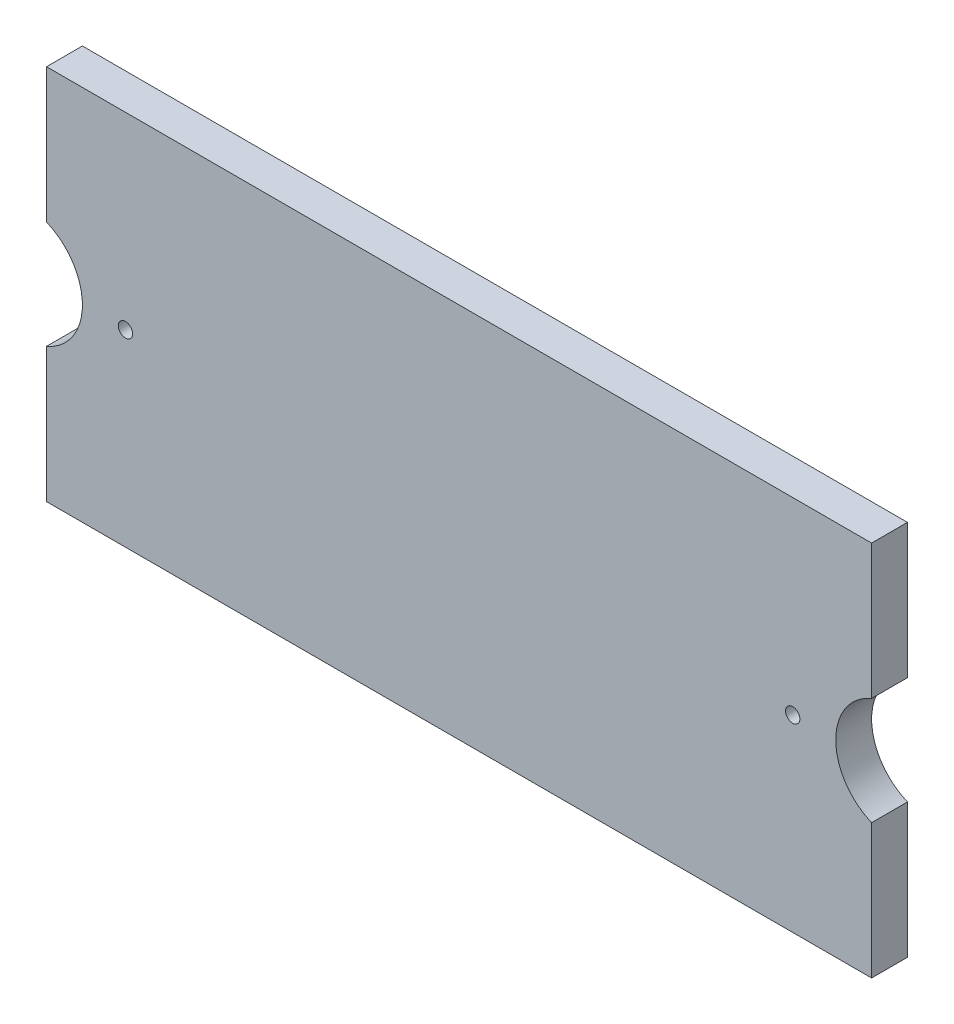
ISO-10303-21;
HEADER;
FILE_DESCRIPTION(('STEP AP214'),'2;1');
FILE_NAME('part.step','',(''),(''),'','','');
FILE_SCHEMA(('AUTOMOTIVE_DESIGN { 1 0 10303 214 1 1 1 1 }'));
ENDSEC;
DATA;
#1=APPLICATION_CONTEXT('core data for automotive mechanical design processes');
#2=APPLICATION_PROTOCOL_DEFINITION('international standard','automotive_design',2000,#1);
#3=PRODUCT_CONTEXT('',#1,'mechanical');
#4=PRODUCT('Part','Part','',(#3));
#5=PRODUCT_RELATED_PRODUCT_CATEGORY('part','',(#4));
#6=PRODUCT_DEFINITION_FORMATION('','',#4);
#7=PRODUCT_DEFINITION_CONTEXT('part definition',#1,'design');
#8=PRODUCT_DEFINITION('design','',#6,#7);
#9=PRODUCT_DEFINITION_SHAPE('','',#8);
#10=(LENGTH_UNIT() NAMED_UNIT(*) SI_UNIT(.MILLI.,.METRE.));
#11=(NAMED_UNIT(*) PLANE_ANGLE_UNIT() SI_UNIT($,.RADIAN.));
#12=(NAMED_UNIT(*) SI_UNIT($,.STERADIAN.) SOLID_ANGLE_UNIT());
#13=UNCERTAINTY_MEASURE_WITH_UNIT(LENGTH_MEASURE(1.E-05),#10,'distance_accuracy_value','');
#14=(GEOMETRIC_REPRESENTATION_CONTEXT(3) GLOBAL_UNCERTAINTY_ASSIGNED_CONTEXT((#13)) GLOBAL_UNIT_ASSIGNED_CONTEXT((#10,
#11,#12)) REPRESENTATION_CONTEXT('',''));
#15=CARTESIAN_POINT('',(0.,0.,0.));
#16=DIRECTION('',(0.,0.,1.));
#17=DIRECTION('',(1.,0.,0.));
#18=AXIS2_PLACEMENT_3D('',#15,#16,#17);
#19=CARTESIAN_POINT('',(-6.25000000000003,52.5,10.));
#20=DIRECTION('',(0.,0.,-1.));
#21=DIRECTION('',(-1.,0.,0.));
#22=AXIS2_PLACEMENT_3D('',#19,#20,#21);
#23=PLANE('',#22);
#24=DIRECTION('',(0.,-1.,0.));
#25=VECTOR('',#24,1.);
#26=CARTESIAN_POINT('',(0.,0.,10.));
#27=LINE('',#26,#25);
#28=CARTESIAN_POINT('',(0.,37.5,10.));
#29=VERTEX_POINT('',#28);
#30=CARTESIAN_POINT('',(0.,0.,10.));
#31=VERTEX_POINT('',#30);
#32=EDGE_CURVE('E145',#29,#31,#27,.T.);
#33=ORIENTED_EDGE('',*,*,#32,.T.);
#34=DIRECTION('',(1.,0.,0.));
#35=VECTOR('',#34,1.);
#36=CARTESIAN_POINT('',(0.,0.,10.));
#37=LINE('',#36,#35);
#38=CARTESIAN_POINT('',(230.,0.,10.));
#39=VERTEX_POINT('',#38);
#40=EDGE_CURVE('E93',#31,#39,#37,.T.);
#41=ORIENTED_EDGE('',*,*,#40,.T.);
#42=DIRECTION('',(0.,1.,0.));
#43=VECTOR('',#42,1.);
#44=CARTESIAN_POINT('',(230.,0.,10.));
#45=LINE('',#44,#43);
#46=CARTESIAN_POINT('',(230.,37.5,10.));
#47=VERTEX_POINT('',#46);
#48=EDGE_CURVE('E160',#39,#47,#45,.T.);
#49=ORIENTED_EDGE('',*,*,#48,.T.);
#50=CARTESIAN_POINT('',(236.25,52.5,10.));
#51=DIRECTION('',(0.,0.,-1.));
#52=DIRECTION('',(1.,0.,0.));
#53=AXIS2_PLACEMENT_3D('',#50,#51,#52);
#54=CIRCLE('',#53,16.25);
#55=CARTESIAN_POINT('',(230.,67.5,10.));
#56=VERTEX_POINT('',#55);
#57=EDGE_CURVE('E173',#47,#56,#54,.T.);
#58=ORIENTED_EDGE('',*,*,#57,.T.);
#59=DIRECTION('',(0.,1.,0.));
#60=VECTOR('',#59,1.);
#61=CARTESIAN_POINT('',(230.,67.5,10.));
#62=LINE('',#61,#60);
#63=CARTESIAN_POINT('',(230.,105.,10.));
#64=VERTEX_POINT('',#63);
#65=EDGE_CURVE('E112',#56,#64,#62,.T.);
#66=ORIENTED_EDGE('',*,*,#65,.T.);
#67=DIRECTION('',(-1.,0.,0.));
#68=VECTOR('',#67,1.);
#69=CARTESIAN_POINT('',(0.,105.,10.));
#70=LINE('',#69,#68);
#71=CARTESIAN_POINT('',(0.,105.,10.));
#72=VERTEX_POINT('',#71);
#73=EDGE_CURVE('E106',#64,#72,#70,.T.);
#74=ORIENTED_EDGE('',*,*,#73,.T.);
#75=DIRECTION('',(0.,-1.,0.));
#76=VECTOR('',#75,1.);
#77=CARTESIAN_POINT('',(0.,67.5,10.));
#78=LINE('',#77,#76);
#79=CARTESIAN_POINT('',(0.,67.5,10.));
#80=VERTEX_POINT('',#79);
#81=EDGE_CURVE('E110',#72,#80,#78,.T.);
#82=ORIENTED_EDGE('',*,*,#81,.T.);
#83=CARTESIAN_POINT('',(-6.25000000000003,52.5,10.));
#84=DIRECTION('',(0.,0.,-1.));
#85=DIRECTION('',(-1.,0.,0.));
#86=AXIS2_PLACEMENT_3D('',#83,#84,#85);
#87=CIRCLE('',#86,16.25);
#88=EDGE_CURVE('E50',#80,#29,#87,.T.);
#89=ORIENTED_EDGE('',*,*,#88,.T.);
#90=EDGE_LOOP('',(#33,#41,#49,#58,#66,#74,#82,#89));
#91=FACE_BOUND('',#90,.T.);
#92=CARTESIAN_POINT('',(208.,52.5,10.));
#93=DIRECTION('',(0.,0.,1.));
#94=DIRECTION('',(1.,0.,0.));
#95=AXIS2_PLACEMENT_3D('',#92,#93,#94);
#96=CIRCLE('',#95,2.);
#97=CARTESIAN_POINT('',(210.,52.5,10.));
#98=VERTEX_POINT('',#97);
#99=EDGE_CURVE('E134',#98,#98,#96,.T.);
#100=ORIENTED_EDGE('',*,*,#99,.F.);
#101=EDGE_LOOP('',(#100));
#102=FACE_BOUND('',#101,.T.);
#103=CARTESIAN_POINT('',(22.,52.5,10.));
#104=DIRECTION('',(0.,0.,1.));
#105=DIRECTION('',(-1.,0.,0.));
#106=AXIS2_PLACEMENT_3D('',#103,#104,#105);
#107=CIRCLE('',#106,2.);
#108=CARTESIAN_POINT('',(20.,52.5,10.));
#109=VERTEX_POINT('',#108);
#110=EDGE_CURVE('E182',#109,#109,#107,.T.);
#111=ORIENTED_EDGE('',*,*,#110,.F.);
#112=EDGE_LOOP('',(#111));
#113=FACE_BOUND('',#112,.T.);
#114=ADVANCED_FACE('F33',(#91,#102,#113),#23,.F.);
#115=CARTESIAN_POINT('',(-6.25000000000003,52.5,0.));
#116=DIRECTION('',(0.,0.,-1.));
#117=DIRECTION('',(-1.,0.,0.));
#118=AXIS2_PLACEMENT_3D('',#115,#116,#117);
#119=PLANE('',#118);
#120=CARTESIAN_POINT('',(208.,52.5,0.));
#121=DIRECTION('',(0.,0.,1.));
#122=DIRECTION('',(1.,0.,0.));
#123=AXIS2_PLACEMENT_3D('',#120,#121,#122);
#124=CIRCLE('',#123,2.);
#125=CARTESIAN_POINT('',(210.,52.5,0.));
#126=VERTEX_POINT('',#125);
#127=EDGE_CURVE('E179',#126,#126,#124,.T.);
#128=ORIENTED_EDGE('',*,*,#127,.T.);
#129=EDGE_LOOP('',(#128));
#130=FACE_BOUND('',#129,.T.);
#131=DIRECTION('',(0.,-1.,0.));
#132=VECTOR('',#131,1.);
#133=CARTESIAN_POINT('',(0.,0.,0.));
#134=LINE('',#133,#132);
#135=CARTESIAN_POINT('',(0.,37.5,0.));
#136=VERTEX_POINT('',#135);
#137=CARTESIAN_POINT('',(0.,0.,0.));
#138=VERTEX_POINT('',#137);
#139=EDGE_CURVE('E130',#136,#138,#134,.T.);
#140=ORIENTED_EDGE('',*,*,#139,.F.);
#141=CARTESIAN_POINT('',(-6.25000000000003,52.5,0.));
#142=DIRECTION('',(0.,0.,-1.));
#143=DIRECTION('',(-1.,0.,0.));
#144=AXIS2_PLACEMENT_3D('',#141,#142,#143);
#145=CIRCLE('',#144,16.25);
#146=CARTESIAN_POINT('',(0.,67.5,0.));
#147=VERTEX_POINT('',#146);
#148=EDGE_CURVE('E85',#147,#136,#145,.T.);
#149=ORIENTED_EDGE('',*,*,#148,.F.);
#150=DIRECTION('',(0.,-1.,0.));
#151=VECTOR('',#150,1.);
#152=CARTESIAN_POINT('',(0.,67.5,0.));
#153=LINE('',#152,#151);
#154=CARTESIAN_POINT('',(0.,105.,0.));
#155=VERTEX_POINT('',#154);
#156=EDGE_CURVE('E79',#155,#147,#153,.T.);
#157=ORIENTED_EDGE('',*,*,#156,.F.);
#158=DIRECTION('',(-1.,0.,0.));
#159=VECTOR('',#158,1.);
#160=CARTESIAN_POINT('',(0.,105.,0.));
#161=LINE('',#160,#159);
#162=CARTESIAN_POINT('',(230.,105.,0.));
#163=VERTEX_POINT('',#162);
#164=EDGE_CURVE('E120',#163,#155,#161,.T.);
#165=ORIENTED_EDGE('',*,*,#164,.F.);
#166=DIRECTION('',(0.,1.,0.));
#167=VECTOR('',#166,1.);
#168=CARTESIAN_POINT('',(230.,67.5,0.));
#169=LINE('',#168,#167);
#170=CARTESIAN_POINT('',(230.,67.5,0.));
#171=VERTEX_POINT('',#170);
#172=EDGE_CURVE('E140',#171,#163,#169,.T.);
#173=ORIENTED_EDGE('',*,*,#172,.F.);
#174=CARTESIAN_POINT('',(236.25,52.5,0.));
#175=DIRECTION('',(0.,0.,-1.));
#176=DIRECTION('',(1.,0.,0.));
#177=AXIS2_PLACEMENT_3D('',#174,#175,#176);
#178=CIRCLE('',#177,16.25);
#179=CARTESIAN_POINT('',(230.,37.5,0.));
#180=VERTEX_POINT('',#179);
#181=EDGE_CURVE('E138',#180,#171,#178,.T.);
#182=ORIENTED_EDGE('',*,*,#181,.F.);
#183=DIRECTION('',(0.,1.,0.));
#184=VECTOR('',#183,1.);
#185=CARTESIAN_POINT('',(230.,0.,0.));
#186=LINE('',#185,#184);
#187=CARTESIAN_POINT('',(230.,0.,0.));
#188=VERTEX_POINT('',#187);
#189=EDGE_CURVE('E136',#188,#180,#186,.T.);
#190=ORIENTED_EDGE('',*,*,#189,.F.);
#191=DIRECTION('',(1.,0.,0.));
#192=VECTOR('',#191,1.);
#193=CARTESIAN_POINT('',(0.,0.,0.));
#194=LINE('',#193,#192);
#195=EDGE_CURVE('E133',#138,#188,#194,.T.);
#196=ORIENTED_EDGE('',*,*,#195,.F.);
#197=EDGE_LOOP('',(#140,#149,#157,#165,#173,#182,#190,#196));
#198=FACE_BOUND('',#197,.T.);
#199=CARTESIAN_POINT('',(22.,52.5,0.));
#200=DIRECTION('',(0.,0.,1.));
#201=DIRECTION('',(-1.,0.,0.));
#202=AXIS2_PLACEMENT_3D('',#199,#200,#201);
#203=CIRCLE('',#202,2.);
#204=CARTESIAN_POINT('',(20.,52.5,0.));
#205=VERTEX_POINT('',#204);
#206=EDGE_CURVE('E185',#205,#205,#203,.T.);
#207=ORIENTED_EDGE('',*,*,#206,.T.);
#208=EDGE_LOOP('',(#207));
#209=FACE_BOUND('',#208,.T.);
#210=ADVANCED_FACE('F164',(#130,#198,#209),#119,.T.);
#211=CARTESIAN_POINT('',(0.,0.,10.));
#212=DIRECTION('',(1.,0.,0.));
#213=DIRECTION('',(0.,0.,-1.));
#214=AXIS2_PLACEMENT_3D('',#211,#212,#213);
#215=PLANE('',#214);
#216=ORIENTED_EDGE('',*,*,#139,.T.);
#217=DIRECTION('',(0.,0.,-1.));
#218=VECTOR('',#217,1.);
#219=CARTESIAN_POINT('',(0.,0.,10.));
#220=LINE('',#219,#218);
#221=EDGE_CURVE('E11',#31,#138,#220,.T.);
#222=ORIENTED_EDGE('',*,*,#221,.F.);
#223=ORIENTED_EDGE('',*,*,#32,.F.);
#224=DIRECTION('',(0.,0.,-1.));
#225=VECTOR('',#224,1.);
#226=CARTESIAN_POINT('',(0.,37.5,10.));
#227=LINE('',#226,#225);
#228=EDGE_CURVE('E126',#29,#136,#227,.T.);
#229=ORIENTED_EDGE('',*,*,#228,.T.);
#230=EDGE_LOOP('',(#216,#222,#223,#229));
#231=FACE_BOUND('',#230,.T.);
#232=ADVANCED_FACE('F35',(#231),#215,.F.);
#233=CARTESIAN_POINT('',(0.,0.,10.));
#234=DIRECTION('',(0.,1.,0.));
#235=DIRECTION('',(0.,0.,1.));
#236=AXIS2_PLACEMENT_3D('',#233,#234,#235);
#237=PLANE('',#236);
#238=ORIENTED_EDGE('',*,*,#195,.T.);
#239=DIRECTION('',(0.,0.,-1.));
#240=VECTOR('',#239,1.);
#241=CARTESIAN_POINT('',(230.,0.,10.));
#242=LINE('',#241,#240);
#243=EDGE_CURVE('E42',#39,#188,#242,.T.);
#244=ORIENTED_EDGE('',*,*,#243,.F.);
#245=ORIENTED_EDGE('',*,*,#40,.F.);
#246=ORIENTED_EDGE('',*,*,#221,.T.);
#247=EDGE_LOOP('',(#238,#244,#245,#246));
#248=FACE_BOUND('',#247,.T.);
#249=ADVANCED_FACE('F217',(#248),#237,.F.);
#250=CARTESIAN_POINT('',(230.,0.,10.));
#251=DIRECTION('',(-1.,0.,0.));
#252=DIRECTION('',(0.,-1.,0.));
#253=AXIS2_PLACEMENT_3D('',#250,#251,#252);
#254=PLANE('',#253);
#255=ORIENTED_EDGE('',*,*,#189,.T.);
#256=DIRECTION('',(0.,0.,-1.));
#257=VECTOR('',#256,1.);
#258=CARTESIAN_POINT('',(230.,37.5,10.));
#259=LINE('',#258,#257);
#260=EDGE_CURVE('E152',#47,#180,#259,.T.);
#261=ORIENTED_EDGE('',*,*,#260,.F.);
#262=ORIENTED_EDGE('',*,*,#48,.F.);
#263=ORIENTED_EDGE('',*,*,#243,.T.);
#264=EDGE_LOOP('',(#255,#261,#262,#263));
#265=FACE_BOUND('',#264,.T.);
#266=ADVANCED_FACE('F158',(#265),#254,.F.);
#267=CARTESIAN_POINT('',(236.25,52.5,10.));
#268=DIRECTION('',(0.,0.,-1.));
#269=DIRECTION('',(-1.,0.,0.));
#270=AXIS2_PLACEMENT_3D('',#267,#268,#269);
#271=CYLINDRICAL_SURFACE('',#270,16.25);
#272=ORIENTED_EDGE('',*,*,#181,.T.);
#273=DIRECTION('',(0.,0.,-1.));
#274=VECTOR('',#273,1.);
#275=CARTESIAN_POINT('',(230.,67.5,10.));
#276=LINE('',#275,#274);
#277=EDGE_CURVE('E149',#56,#171,#276,.T.);
#278=ORIENTED_EDGE('',*,*,#277,.F.);
#279=ORIENTED_EDGE('',*,*,#57,.F.);
#280=ORIENTED_EDGE('',*,*,#260,.T.);
#281=EDGE_LOOP('',(#272,#278,#279,#280));
#282=FACE_BOUND('',#281,.T.);
#283=ADVANCED_FACE('F169',(#282),#271,.F.);
#284=CARTESIAN_POINT('',(230.,67.5,10.));
#285=DIRECTION('',(-1.,0.,0.));
#286=DIRECTION('',(0.,0.,1.));
#287=AXIS2_PLACEMENT_3D('',#284,#285,#286);
#288=PLANE('',#287);
#289=ORIENTED_EDGE('',*,*,#172,.T.);
#290=DIRECTION('',(0.,0.,-1.));
#291=VECTOR('',#290,1.);
#292=CARTESIAN_POINT('',(230.,105.,10.));
#293=LINE('',#292,#291);
#294=EDGE_CURVE('E121',#64,#163,#293,.T.);
#295=ORIENTED_EDGE('',*,*,#294,.F.);
#296=ORIENTED_EDGE('',*,*,#65,.F.);
#297=ORIENTED_EDGE('',*,*,#277,.T.);
#298=EDGE_LOOP('',(#289,#295,#296,#297));
#299=FACE_BOUND('',#298,.T.);
#300=ADVANCED_FACE('F172',(#299),#288,.F.);
#301=CARTESIAN_POINT('',(0.,105.,10.));
#302=DIRECTION('',(0.,-1.,0.));
#303=DIRECTION('',(0.,0.,-1.));
#304=AXIS2_PLACEMENT_3D('',#301,#302,#303);
#305=PLANE('',#304);
#306=ORIENTED_EDGE('',*,*,#164,.T.);
#307=DIRECTION('',(0.,0.,-1.));
#308=VECTOR('',#307,1.);
#309=CARTESIAN_POINT('',(0.,105.,10.));
#310=LINE('',#309,#308);
#311=EDGE_CURVE('E117',#72,#155,#310,.T.);
#312=ORIENTED_EDGE('',*,*,#311,.F.);
#313=ORIENTED_EDGE('',*,*,#73,.F.);
#314=ORIENTED_EDGE('',*,*,#294,.T.);
#315=EDGE_LOOP('',(#306,#312,#313,#314));
#316=FACE_BOUND('',#315,.T.);
#317=ADVANCED_FACE('F118',(#316),#305,.F.);
#318=CARTESIAN_POINT('',(0.,67.5,10.));
#319=DIRECTION('',(1.,0.,0.));
#320=DIRECTION('',(0.,0.,-1.));
#321=AXIS2_PLACEMENT_3D('',#318,#319,#320);
#322=PLANE('',#321);
#323=ORIENTED_EDGE('',*,*,#156,.T.);
#324=DIRECTION('',(0.,0.,-1.));
#325=VECTOR('',#324,1.);
#326=CARTESIAN_POINT('',(0.,67.5,10.));
#327=LINE('',#326,#325);
#328=EDGE_CURVE('E122',#80,#147,#327,.T.);
#329=ORIENTED_EDGE('',*,*,#328,.F.);
#330=ORIENTED_EDGE('',*,*,#81,.F.);
#331=ORIENTED_EDGE('',*,*,#311,.T.);
#332=EDGE_LOOP('',(#323,#329,#330,#331));
#333=FACE_BOUND('',#332,.T.);
#334=ADVANCED_FACE('F124',(#333),#322,.F.);
#335=CARTESIAN_POINT('',(-6.25000000000003,52.5,10.));
#336=DIRECTION('',(0.,0.,-1.));
#337=DIRECTION('',(-1.,0.,0.));
#338=AXIS2_PLACEMENT_3D('',#335,#336,#337);
#339=CYLINDRICAL_SURFACE('',#338,16.25);
#340=ORIENTED_EDGE('',*,*,#148,.T.);
#341=ORIENTED_EDGE('',*,*,#228,.F.);
#342=ORIENTED_EDGE('',*,*,#88,.F.);
#343=ORIENTED_EDGE('',*,*,#328,.T.);
#344=EDGE_LOOP('',(#340,#341,#342,#343));
#345=FACE_BOUND('',#344,.T.);
#346=ADVANCED_FACE('F205',(#345),#339,.F.);
#347=CARTESIAN_POINT('',(208.,52.5,10.));
#348=DIRECTION('',(0.,0.,-1.));
#349=DIRECTION('',(-1.,0.,0.));
#350=AXIS2_PLACEMENT_3D('',#347,#348,#349);
#351=CYLINDRICAL_SURFACE('',#350,2.);
#352=ORIENTED_EDGE('',*,*,#99,.T.);
#353=EDGE_LOOP('',(#352));
#354=FACE_BOUND('',#353,.T.);
#355=ORIENTED_EDGE('',*,*,#127,.F.);
#356=EDGE_LOOP('',(#355));
#357=FACE_BOUND('',#356,.T.);
#358=ADVANCED_FACE('F202',(#354,#357),#351,.F.);
#359=CARTESIAN_POINT('',(22.,52.5,10.));
#360=DIRECTION('',(0.,0.,-1.));
#361=DIRECTION('',(-1.,0.,0.));
#362=AXIS2_PLACEMENT_3D('',#359,#360,#361);
#363=CYLINDRICAL_SURFACE('',#362,2.);
#364=ORIENTED_EDGE('',*,*,#110,.T.);
#365=EDGE_LOOP('',(#364));
#366=FACE_BOUND('',#365,.T.);
#367=ORIENTED_EDGE('',*,*,#206,.F.);
#368=EDGE_LOOP('',(#367));
#369=FACE_BOUND('',#368,.T.);
#370=ADVANCED_FACE('F191',(#366,#369),#363,.F.);
#371=CLOSED_SHELL('',(#114,#210,#232,#249,#266,#283,#300,#317,#334,#346,#358,#370));
#372=MANIFOLD_SOLID_BREP('B2',#371);
#373=ADVANCED_BREP_SHAPE_REPRESENTATION('',(#18,#372),#14);
#374=SHAPE_DEFINITION_REPRESENTATION(#9,#373);
ENDSEC;
END-ISO-10303-21;
